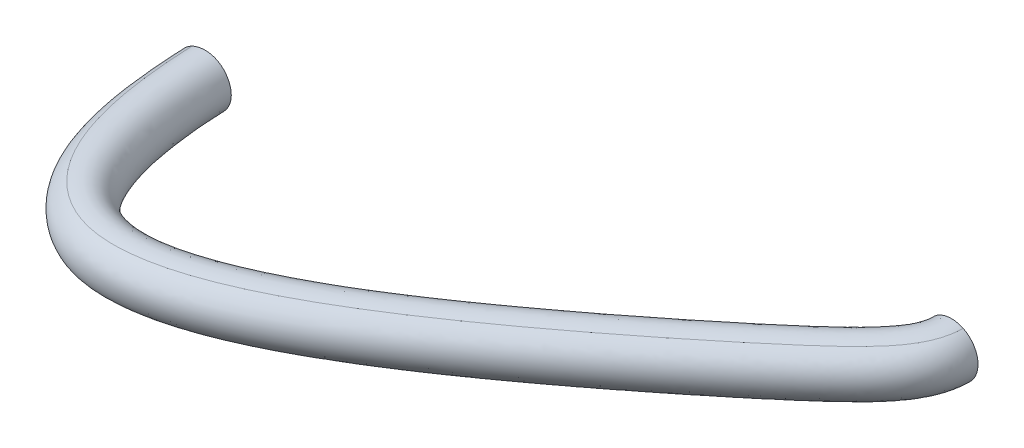
ISO-10303-21;
HEADER;
FILE_DESCRIPTION(('STEP AP214'),'2;1');
FILE_NAME('part.step','',(''),(''),'','','');
FILE_SCHEMA(('AUTOMOTIVE_DESIGN { 1 0 10303 214 1 1 1 1 }'));
ENDSEC;
DATA;
#1=APPLICATION_CONTEXT('core data for automotive mechanical design processes');
#2=APPLICATION_PROTOCOL_DEFINITION('international standard','automotive_design',2000,#1);
#3=PRODUCT_CONTEXT('',#1,'mechanical');
#4=PRODUCT('Part','Part','',(#3));
#5=PRODUCT_RELATED_PRODUCT_CATEGORY('part','',(#4));
#6=PRODUCT_DEFINITION_FORMATION('','',#4);
#7=PRODUCT_DEFINITION_CONTEXT('part definition',#1,'design');
#8=PRODUCT_DEFINITION('design','',#6,#7);
#9=PRODUCT_DEFINITION_SHAPE('','',#8);
#10=(LENGTH_UNIT() NAMED_UNIT(*) SI_UNIT(.MILLI.,.METRE.));
#11=(NAMED_UNIT(*) PLANE_ANGLE_UNIT() SI_UNIT($,.RADIAN.));
#12=(NAMED_UNIT(*) SI_UNIT($,.STERADIAN.) SOLID_ANGLE_UNIT());
#13=UNCERTAINTY_MEASURE_WITH_UNIT(LENGTH_MEASURE(1.E-05),#10,'distance_accuracy_value','');
#14=(GEOMETRIC_REPRESENTATION_CONTEXT(3) GLOBAL_UNCERTAINTY_ASSIGNED_CONTEXT((#13)) GLOBAL_UNIT_ASSIGNED_CONTEXT((#10,
#11,#12)) REPRESENTATION_CONTEXT('',''));
#15=CARTESIAN_POINT('',(0.,0.,0.));
#16=DIRECTION('',(0.,0.,1.));
#17=DIRECTION('',(1.,0.,0.));
#18=AXIS2_PLACEMENT_3D('',#15,#16,#17);
#19=CARTESIAN_POINT('',(0.005,-0.015,0.38));
#20=CARTESIAN_POINT('',(0.006557474261579,-0.015,0.419047749713));
#21=CARTESIAN_POINT('',(0.01842559288904,-0.015,0.470007075915));
#22=CARTESIAN_POINT('',(0.05072787580329,-0.015,0.492409384659));
#23=CARTESIAN_POINT('',(0.09265207975633,-0.015,0.49542710813));
#24=CARTESIAN_POINT('',(0.153025798294,-0.015,0.471761765824));
#25=CARTESIAN_POINT('',(0.233879896269,-0.015,0.414932300408));
#26=CARTESIAN_POINT('',(0.293069376074,-0.015,0.367906845199));
#27=CARTESIAN_POINT('',(0.324563591851,-0.015,0.341018848423));
#28=CARTESIAN_POINT('',(0.34547789,-0.015,0.319341958793));
#29=CARTESIAN_POINT('',(0.350000016624,-0.015,0.308052981527));
#30=CARTESIAN_POINT('',(0.350000016624,-0.015,0.300000014249));
#31=CARTESIAN_POINT('',(0.007242211865819,-0.015,0.379910566235));
#32=CARTESIAN_POINT('',(0.008790809261584,-0.015,0.418735762264));
#33=CARTESIAN_POINT('',(0.02079235202687,-0.015,0.469060161785));
#34=CARTESIAN_POINT('',(0.05155070911989,-0.015,0.490136699165));
#35=CARTESIAN_POINT('',(0.09196723121776,-0.015,0.493200372818));
#36=CARTESIAN_POINT('',(0.15186993797,-0.015,0.469847530246));
#37=CARTESIAN_POINT('',(0.232516978086,-0.015,0.413138733967));
#38=CARTESIAN_POINT('',(0.29165324121,-0.015,0.366165772673));
#39=CARTESIAN_POINT('',(0.323082573523,-0.015,0.339341658557));
#40=CARTESIAN_POINT('',(0.343692170929,-0.015,0.317907755657));
#41=CARTESIAN_POINT('',(0.347756021872,-0.015,0.30744343981));
#42=CARTESIAN_POINT('',(0.347756021872,-0.015,0.300000014249));
#43=CARTESIAN_POINT('',(0.01388476138257,-0.01357926649544,0.379645618831));
#44=CARTESIAN_POINT('',(0.01540827786274,-0.01357926649544,0.417842006193));
#45=CARTESIAN_POINT('',(0.02774554629291,-0.01357926649544,0.466197778229));
#46=CARTESIAN_POINT('',(0.05398379293613,-0.01357926649544,0.483441303791));
#47=CARTESIAN_POINT('',(0.08999963680581,-0.01357926649544,0.486613861152));
#48=CARTESIAN_POINT('',(0.148423724582,-0.01357926649544,0.464170570238));
#49=CARTESIAN_POINT('',(0.228497078217,-0.01357926649544,0.407828571374));
#50=CARTESIAN_POINT('',(0.287453206429,-0.01357926649544,0.361000122334));
#51=CARTESIAN_POINT('',(0.318686615735,-0.01357926649544,0.334398392806));
#52=CARTESIAN_POINT('',(0.338407169199,-0.01357926649544,0.313633321723));
#53=CARTESIAN_POINT('',(0.341108190555,-0.01357926649544,0.305721225611));
#54=CARTESIAN_POINT('',(0.341108190555,-0.01357926649544,0.300000014249));
#55=CARTESIAN_POINT('',(0.02353279027151,-0.001737662492842,0.379260793668));
#56=CARTESIAN_POINT('',(0.02501902939073,-0.001737662492842,0.416522592833));
#57=CARTESIAN_POINT('',(0.03788544009124,-0.001737662492842,0.462080131594));
#58=CARTESIAN_POINT('',(0.05752092514672,-0.001737662492842,0.473690420028));
#59=CARTESIAN_POINT('',(0.08709906967364,-0.001737662492842,0.477040121257));
#60=CARTESIAN_POINT('',(0.143433565964,-0.001737662492842,0.455929231292));
#61=CARTESIAN_POINT('',(0.222645968658,-0.001737662492842,0.400113495749));
#62=CARTESIAN_POINT('',(0.281356132219,-0.001737662492842,0.353502614822));
#63=CARTESIAN_POINT('',(0.312307555228,-0.001737662492842,0.327200789267));
#64=CARTESIAN_POINT('',(0.330727304881,-0.001737662492842,0.307442738112));
#65=CARTESIAN_POINT('',(0.331452490071,-0.001737662492842,0.303161526382));
#66=CARTESIAN_POINT('',(0.331452490071,-0.001737662492842,0.300000014249));
#67=CARTESIAN_POINT('',(0.01517780091992,0.01557342152532,0.379594044136));
#68=CARTESIAN_POINT('',(0.01669623989436,0.01557342152532,0.417663132332));
#69=CARTESIAN_POINT('',(0.02910841530669,0.01557342152532,0.465649757129));
#70=CARTESIAN_POINT('',(0.05445814885886,0.01557342152532,0.482131970717));
#71=CARTESIAN_POINT('',(0.08960679319997,0.01557342152532,0.485330095041));
#72=CARTESIAN_POINT('',(0.147756411067,0.01557342152532,0.463066461651));
#73=CARTESIAN_POINT('',(0.227711716813,0.01557342152532,0.406794368846));
#74=CARTESIAN_POINT('',(0.28663638728,0.01557342152532,0.359995815837));
#75=CARTESIAN_POINT('',(0.317832252845,0.01557342152532,0.333432059154));
#76=CARTESIAN_POINT('',(0.337377557512,0.01557342152532,0.312805369235));
#77=CARTESIAN_POINT('',(0.339814122862,0.01557342152532,0.305372571974));
#78=CARTESIAN_POINT('',(0.339814122862,0.01557342152532,0.300000014249));
#79=CARTESIAN_POINT('',(0.002526593477922,0.01546818446495,0.380098655288));
#80=CARTESIAN_POINT('',(0.004093574195109,0.01546818446495,0.419384743257));
#81=CARTESIAN_POINT('',(0.01582849219146,0.01546818446495,0.471065045818));
#82=CARTESIAN_POINT('',(0.04982127047533,0.01546818446495,0.494907617769));
#83=CARTESIAN_POINT('',(0.09339315710763,0.01546818446495,0.497881050005));
#84=CARTESIAN_POINT('',(0.15430600015,0.01546818446495,0.473874796551));
#85=CARTESIAN_POINT('',(0.23537917888,0.01546818446495,0.416910032546));
#86=CARTESIAN_POINT('',(0.294632641038,0.01546818446495,0.369829253808));
#87=CARTESIAN_POINT('',(0.326199300556,0.01546818446495,0.34286300788));
#88=CARTESIAN_POINT('',(0.347446516439,0.01546818446495,0.320930055828));
#89=CARTESIAN_POINT('',(0.352475389867,0.01546818446495,0.308705754859));
#90=CARTESIAN_POINT('',(0.352475389867,0.01546818446495,0.300000014249));
#91=CARTESIAN_POINT('',(-0.00152858359605,0.0135175903309,0.380260401713));
#92=CARTESIAN_POINT('',(5.395365600005E-05,0.0135175903309,0.419936510688));
#93=CARTESIAN_POINT('',(0.01157192659682,0.0135175903309,0.47280098011));
#94=CARTESIAN_POINT('',(0.04833499127388,0.0135175903309,0.49900259377));
#95=CARTESIAN_POINT('',(0.094606681011,0.0135175903309,0.501904068374));
#96=CARTESIAN_POINT('',(0.156405436219,0.0135175903309,0.477339279514));
#97=CARTESIAN_POINT('',(0.237836840377,0.0135175903309,0.42015246689));
#98=CARTESIAN_POINT('',(0.297195745534,0.0135175903309,0.372981250452));
#99=CARTESIAN_POINT('',(0.328881266912,0.0135175903309,0.345885913553));
#100=CARTESIAN_POINT('',(0.350673975661,0.0135175903309,0.323534377141));
#101=CARTESIAN_POINT('',(0.3565337914,0.0135175903309,0.309773964874));
#102=CARTESIAN_POINT('',(0.3565337914,0.0135175903309,0.300000014249));
#103=(BOUNDED_SURFACE() B_SPLINE_SURFACE(3,3,((#19,#20,#21,#22,#23,#24,#25,#26,#27,#28,#29,#30),
(#31,#32,#33,#34,#35,#36,#37,#38,#39,#40,#41,#42),(#43,#44,#45,#46,#47,#48,#49,#50,#51,#52,#53,
#54),(#55,#56,#57,#58,#59,#60,#61,#62,#63,#64,#65,#66),(#67,#68,#69,#70,#71,#72,#73,#74,#75,#76,
#77,#78),(#79,#80,#81,#82,#83,#84,#85,#86,#87,#88,#89,#90),(#91,#92,#93,#94,#95,#96,#97,#98,#99,
#100,#101,#102)),.UNSPECIFIED.,.F.,.F.,.F.) B_SPLINE_SURFACE_WITH_KNOTS((4,1,1,1,4),(4,1,1,1,1,
1,1,1,1,4),(-3.14159265359,-2.692793703077,-1.795195802051,-0.448798950513,0.448798950513),(0.,
0.142857142857,0.25,0.285714285714,0.428571428571,0.571428571429,0.678571428571,0.785714285714,
0.857142857143,1.),
.UNSPECIFIED.) GEOMETRIC_REPRESENTATION_ITEM() RATIONAL_B_SPLINE_SURFACE(((1.,1.,1.,1.,1.,1.,1.,
1.,1.,1.,1.,1.),(1.,1.,1.,1.,1.,1.,1.,1.,1.,1.,1.,1.),(1.,1.,1.,1.,1.,1.,1.,1.,1.,1.,1.,1.),(1.,
1.,1.,1.,1.,1.,1.,1.,1.,1.,1.,1.),(1.,1.,1.,1.,1.,1.,1.,1.,1.,1.,1.,1.),(1.,1.,1.,1.,1.,1.,1.,
1.,1.,1.,1.,1.),(1.,1.,1.,1.,1.,1.,1.,1.,1.,1.,1.,1.))) REPRESENTATION_ITEM('') SURFACE());
#104=CARTESIAN_POINT('',(0.00500000000011853,-0.015,0.380000000002972));
#105=CARTESIAN_POINT('',(0.00724221186593686,-0.015,0.379910566237955));
#106=CARTESIAN_POINT('',(0.0138847613826859,-0.01357926649544,0.379645618833907));
#107=CARTESIAN_POINT('',(0.0235327902716231,-0.001737662492842,0.379260793670836));
#108=CARTESIAN_POINT('',(0.0151778009200356,0.01557342152532,0.379594044138897));
#109=CARTESIAN_POINT('',(0.00252659347804125,0.01546818446495,0.38009865529099));
#110=CARTESIAN_POINT('',(-0.00152858359592956,0.0135175903309,0.38026040171602));
#111=(BOUNDED_CURVE() B_SPLINE_CURVE(3,(#104,#105,#106,#107,#108,#109,#110),.UNSPECIFIED.,.F.,
.F.) B_SPLINE_CURVE_WITH_KNOTS((4,1,1,1,4),(-3.14159265359,-2.692793703077,-1.795195802051,
-0.448798950513,0.448798950513),
.UNSPECIFIED.) CURVE() GEOMETRIC_REPRESENTATION_ITEM() RATIONAL_B_SPLINE_CURVE((1.,1.,1.,1.,1.,
1.,1.)) REPRESENTATION_ITEM(''));
#112=CARTESIAN_POINT('',(0.005,-0.015,0.38));
#113=VERTEX_POINT('',#112);
#114=CARTESIAN_POINT('',(-0.001535819537403,0.01353381759162,0.380260690329));
#115=VERTEX_POINT('',#114);
#116=EDGE_CURVE('E30',#113,#115,#111,.T.);
#117=CARTESIAN_POINT('',(-0.00152858359605,0.0135175903309,0.380260401713));
#118=CARTESIAN_POINT('',(5.395365600005E-05,0.0135175903309,0.419936510688));
#119=CARTESIAN_POINT('',(0.01157192659682,0.0135175903309,0.47280098011));
#120=CARTESIAN_POINT('',(0.04833499127388,0.0135175903309,0.49900259377));
#121=CARTESIAN_POINT('',(0.094606681011,0.0135175903309,0.501904068374));
#122=CARTESIAN_POINT('',(0.156405436219,0.0135175903309,0.477339279514));
#123=CARTESIAN_POINT('',(0.237836840377,0.0135175903309,0.42015246689));
#124=CARTESIAN_POINT('',(0.297195745534,0.0135175903309,0.372981250452));
#125=CARTESIAN_POINT('',(0.328881266912,0.0135175903309,0.345885913553));
#126=CARTESIAN_POINT('',(0.350673975661,0.0135175903309,0.323534377141));
#127=CARTESIAN_POINT('',(0.3565337914,0.0135175903309,0.309773964874));
#128=CARTESIAN_POINT('',(0.3565337914,0.0135175903309,0.300000014249));
#129=(BOUNDED_CURVE() B_SPLINE_CURVE(3,(#117,#118,#119,#120,#121,#122,#123,#124,#125,#126,#127,
#128),.UNSPECIFIED.,.F.,.F.) B_SPLINE_CURVE_WITH_KNOTS((4,1,1,1,1,1,1,1,1,4),(0.,0.142857142857,
0.25,0.285714285714,0.428571428571,0.571428571429,0.678571428571,0.785714285714,0.857142857143,
1.),.UNSPECIFIED.) CURVE() GEOMETRIC_REPRESENTATION_ITEM() RATIONAL_B_SPLINE_CURVE((1.,1.,1.,1.,
1.,1.,1.,1.,1.,1.,1.,1.)) REPRESENTATION_ITEM(''));
#130=CARTESIAN_POINT('',(0.356533778506,0.01351756661418,0.300000014249));
#131=VERTEX_POINT('',#130);
#132=EDGE_CURVE('E54',#115,#131,#129,.T.);
#133=CARTESIAN_POINT('',(0.3565337914,0.0135175903309,0.300000014249));
#134=CARTESIAN_POINT('',(0.352475389867,0.01546818446495,0.300000014249));
#135=CARTESIAN_POINT('',(0.339814122862,0.01557342152532,0.300000014249));
#136=CARTESIAN_POINT('',(0.331452490071,-0.001737662492842,0.300000014249));
#137=CARTESIAN_POINT('',(0.341108190555,-0.01357926649544,0.300000014249));
#138=CARTESIAN_POINT('',(0.347756021872,-0.015,0.300000014249));
#139=CARTESIAN_POINT('',(0.350000016624,-0.015,0.300000014249));
#140=(BOUNDED_CURVE() B_SPLINE_CURVE(3,(#133,#134,#135,#136,#137,#138,#139),.UNSPECIFIED.,.F.,
.F.) B_SPLINE_CURVE_WITH_KNOTS((4,1,1,1,4),(-3.14159265359,-2.243994752564,-0.897597901026,0.,
0.448798950513),
.UNSPECIFIED.) CURVE() GEOMETRIC_REPRESENTATION_ITEM() RATIONAL_B_SPLINE_CURVE((1.,1.,1.,1.,1.,
1.,1.)) REPRESENTATION_ITEM(''));
#141=CARTESIAN_POINT('',(0.350000016624,-0.015,0.300000014249));
#142=VERTEX_POINT('',#141);
#143=EDGE_CURVE('E11',#142,#131,#140,.F.);
#144=CARTESIAN_POINT('',(0.005,-0.015,0.38));
#145=CARTESIAN_POINT('',(0.005778737130792,-0.015,0.399523874856));
#146=CARTESIAN_POINT('',(0.007515621863847,-0.01499999999999,0.417232028235));
#147=CARTESIAN_POINT('',(0.01019272892047,-0.01500000000001,0.433141976618));
#148=CARTESIAN_POINT('',(0.01382238984853,-0.01499999999998,0.447232875823));
#149=CARTESIAN_POINT('',(0.01842538499625,-0.01500000000003,0.459473144587));
#150=CARTESIAN_POINT('',(0.02401549894582,-0.01499999999997,0.469839973693));
#151=CARTESIAN_POINT('',(0.03059043941091,-0.01500000000002,0.478330720727));
#152=CARTESIAN_POINT('',(0.03812911959229,-0.01499999999999,0.484966190353));
#153=CARTESIAN_POINT('',(0.04659530399853,-0.01500000000001,0.489785800224));
#154=CARTESIAN_POINT('',(0.05594761772462,-0.015,0.492834632429));
#155=CARTESIAN_POINT('',(0.06615591919479,-0.015,0.494142370543));
#156=CARTESIAN_POINT('',(0.0882921535349,-0.015,0.493245873949));
#157=CARTESIAN_POINT('',(0.100223730548,-0.015,0.491035041519));
#158=CARTESIAN_POINT('',(0.112867992916,-0.01499999999999,0.487264006157));
#159=CARTESIAN_POINT('',(0.126110330321,-0.01500000000001,0.482085015298));
#160=CARTESIAN_POINT('',(0.139846156031,-0.01499999999998,0.47563642084));
#161=CARTESIAN_POINT('',(0.153962235063,-0.01500000000001,0.468068563624));
#162=CARTESIAN_POINT('',(0.168325481062,-0.01499999999999,0.459559304083));
#163=CARTESIAN_POINT('',(0.182779221944,-0.01500000000001,0.450319199163));
#164=CARTESIAN_POINT('',(0.197146934257,-0.015,0.440586325404));
#165=CARTESIAN_POINT('',(0.211243446296,-0.015,0.430610748285));
#166=CARTESIAN_POINT('',(0.22489360994,-0.015,0.42062863775));
#167=CARTESIAN_POINT('',(0.257555688191,-0.015,0.396122118324));
#168=CARTESIAN_POINT('',(0.275945550487,-0.015,0.381658387208));
#169=CARTESIAN_POINT('',(0.291450803387,-0.01500000000001,0.369830965455));
#170=CARTESIAN_POINT('',(0.31031414583,-0.01499999999999,0.351392963739));
#171=CARTESIAN_POINT('',(0.312747993757,-0.01500000000002,0.355333418741));
#172=CARTESIAN_POINT('',(0.335727950439,-0.01499999999998,0.327210310964));
#173=CARTESIAN_POINT('',(0.331514973562,-0.01500000000002,0.337380109009));
#174=CARTESIAN_POINT('',(0.344021348933,-0.01499999999999,0.320890502664));
#175=CARTESIAN_POINT('',(0.345632683237,-0.01500000000001,0.31846708728));
#176=CARTESIAN_POINT('',(0.348835167037,-0.015,0.311766143979));
#177=CARTESIAN_POINT('',(0.350000016624,-0.015,0.306039739708));
#178=CARTESIAN_POINT('',(0.350000016624,-0.015,0.300000014249));
#179=(BOUNDED_CURVE() B_SPLINE_CURVE(12,(#144,#145,#146,#147,#148,#149,#150,#151,#152,#153,#154,
#155,#156,#157,#158,#159,#160,#161,#162,#163,#164,#165,#166,#167,#168,#169,#170,#171,#172,#173,
#174,#175,#176,#177,#178),.UNSPECIFIED.,.F.,.F.) B_SPLINE_CURVE_WITH_KNOTS((13,11,11,13),(0.,
0.285714285714,0.571428571429,1.),
.UNSPECIFIED.) CURVE() GEOMETRIC_REPRESENTATION_ITEM() RATIONAL_B_SPLINE_CURVE((1.,1.,1.,1.,1.,
1.,1.,1.,1.,1.,1.,1.,1.,1.,1.,1.,1.,1.,1.,1.,1.,1.,1.,1.,1.,1.,1.,1.,1.,1.,1.,1.,1.,1.,1.)) REPRESENTATION_ITEM(''));
#180=EDGE_CURVE('E56',#113,#142,#179,.T.);
#181=ORIENTED_EDGE('',*,*,#116,.T.);
#182=ORIENTED_EDGE('',*,*,#132,.T.);
#183=ORIENTED_EDGE('',*,*,#143,.F.);
#184=ORIENTED_EDGE('',*,*,#180,.F.);
#185=EDGE_LOOP('',(#181,#182,#183,#184));
#186=FACE_BOUND('',#185,.T.);
#187=ADVANCED_FACE('F17',(#186),#103,.T.);
#188=CARTESIAN_POINT('',(0.350000016624,0.,0.300000014249));
#189=DIRECTION('',(0.,0.,-1.));
#190=DIRECTION('',(-1.,0.,0.));
#191=AXIS2_PLACEMENT_3D('',#188,#189,#190);
#192=PLANE('',#191);
#193=ORIENTED_EDGE('',*,*,#143,.T.);
#194=CARTESIAN_POINT('',(0.350000016624,-0.015,0.300000014249));
#195=CARTESIAN_POINT('',(0.354488006129,-0.015,0.300000014249));
#196=CARTESIAN_POINT('',(0.363441995232,-0.01072977434251,0.300000014249));
#197=CARTESIAN_POINT('',(0.366696785464,0.003848809308946,0.300000014249));
#198=CARTESIAN_POINT('',(0.360592192934,0.01156699619685,0.300000014249));
#199=CARTESIAN_POINT('',(0.3565337914,0.0135175903309,0.300000014249));
#200=(BOUNDED_CURVE() B_SPLINE_CURVE(3,(#194,#195,#196,#197,#198,#199),.UNSPECIFIED.,.F.,
.F.) B_SPLINE_CURVE_WITH_KNOTS((4,1,1,4),(0.448798950513,1.346396851539,2.243994752565,
3.14159265359),
.UNSPECIFIED.) CURVE() GEOMETRIC_REPRESENTATION_ITEM() RATIONAL_B_SPLINE_CURVE((1.,1.,1.,1.,1.,1.)) REPRESENTATION_ITEM(''));
#201=EDGE_CURVE('E61',#131,#142,#200,.F.);
#202=ORIENTED_EDGE('',*,*,#201,.T.);
#203=EDGE_LOOP('',(#193,#202));
#204=FACE_BOUND('',#203,.T.);
#205=ADVANCED_FACE('F107',(#204),#192,.T.);
#206=CARTESIAN_POINT('',(0.005,0.,0.38));
#207=DIRECTION('',(0.0398547121637157,0.,0.999205485332395));
#208=DIRECTION('',(0.,-1.,0.));
#209=AXIS2_PLACEMENT_3D('',#206,#207,#208);
#210=PLANE('',#209);
#211=ORIENTED_EDGE('',*,*,#116,.F.);
#212=CARTESIAN_POINT('',(-0.00152858359605,0.0135175903309,0.380260401713));
#213=CARTESIAN_POINT('',(-0.005583760670022,0.01156699619685,0.380422148138));
#214=CARTESIAN_POINT('',(-0.01168350301231,0.003848809308946,0.380665444916));
#215=CARTESIAN_POINT('',(-0.008431298758439,-0.01072977434251,0.380535726188));
#216=CARTESIAN_POINT('',(0.0005155762683616,-0.015,0.38017886753));
#217=CARTESIAN_POINT('',(0.005,-0.015,0.38));
#218=(BOUNDED_CURVE() B_SPLINE_CURVE(3,(#212,#213,#214,#215,#216,#217),.UNSPECIFIED.,.F.,
.F.) B_SPLINE_CURVE_WITH_KNOTS((4,1,1,4),(0.448798950513,1.346396851538,2.243994752564,
3.14159265359),
.UNSPECIFIED.) CURVE() GEOMETRIC_REPRESENTATION_ITEM() RATIONAL_B_SPLINE_CURVE((1.,1.,1.,1.,1.,1.)) REPRESENTATION_ITEM(''));
#219=EDGE_CURVE('E64',#115,#113,#218,.T.);
#220=ORIENTED_EDGE('',*,*,#219,.F.);
#221=EDGE_LOOP('',(#211,#220));
#222=FACE_BOUND('',#221,.T.);
#223=ADVANCED_FACE('F19',(#222),#210,.F.);
#224=CARTESIAN_POINT('',(-0.00152858359605,0.0135175903309,0.380260401713));
#225=CARTESIAN_POINT('',(5.395365600005E-05,0.0135175903309,0.419936510688));
#226=CARTESIAN_POINT('',(0.01157192659682,0.0135175903309,0.47280098011));
#227=CARTESIAN_POINT('',(0.04833499127388,0.0135175903309,0.49900259377));
#228=CARTESIAN_POINT('',(0.094606681011,0.0135175903309,0.501904068374));
#229=CARTESIAN_POINT('',(0.156405436219,0.0135175903309,0.477339279514));
#230=CARTESIAN_POINT('',(0.237836840377,0.0135175903309,0.42015246689));
#231=CARTESIAN_POINT('',(0.297195745534,0.0135175903309,0.372981250452));
#232=CARTESIAN_POINT('',(0.328881266912,0.0135175903309,0.345885913553));
#233=CARTESIAN_POINT('',(0.350673975661,0.0135175903309,0.323534377141));
#234=CARTESIAN_POINT('',(0.3565337914,0.0135175903309,0.309773964874));
#235=CARTESIAN_POINT('',(0.3565337914,0.0135175903309,0.300000014249));
#236=CARTESIAN_POINT('',(-0.005583760670022,0.01156699619685,0.380422148138));
#237=CARTESIAN_POINT('',(-0.003985666883109,0.01156699619685,0.42048827812));
#238=CARTESIAN_POINT('',(0.007315361002187,0.01156699619685,0.474536914401));
#239=CARTESIAN_POINT('',(0.04684871207243,0.01156699619685,0.503097569771));
#240=CARTESIAN_POINT('',(0.09582020491438,0.01156699619685,0.505927086744));
#241=CARTESIAN_POINT('',(0.158504872287,0.01156699619685,0.480803762477));
#242=CARTESIAN_POINT('',(0.240294501874,0.01156699619685,0.423394901234));
#243=CARTESIAN_POINT('',(0.299758850031,0.01156699619685,0.376133247097));
#244=CARTESIAN_POINT('',(0.331563233267,0.01156699619685,0.348908819227));
#245=CARTESIAN_POINT('',(0.353901434883,0.01156699619685,0.326138698453));
#246=CARTESIAN_POINT('',(0.360592192934,0.01156699619685,0.310842174889));
#247=CARTESIAN_POINT('',(0.360592192934,0.01156699619685,0.300000014249));
#248=CARTESIAN_POINT('',(-0.01168350301231,0.003848809308946,0.380665444916));
#249=CARTESIAN_POINT('',(-0.01006201648014,0.003848809308946,0.421318059108));
#250=CARTESIAN_POINT('',(0.0009130371158356,0.003848809308946,0.477148420615));
#251=CARTESIAN_POINT('',(0.04461309797344,0.003848809308946,0.509256956134));
#252=CARTESIAN_POINT('',(0.09764520940174,0.003848809308946,0.511978396249));
#253=CARTESIAN_POINT('',(0.161662945295,0.003848809308946,0.486015026406));
#254=CARTESIAN_POINT('',(0.243991178206,0.003848809308946,0.428272107651));
#255=CARTESIAN_POINT('',(0.30361426501,0.003848809308946,0.380874483297));
#256=CARTESIAN_POINT('',(0.335597460521,0.003848809308946,0.35345568294));
#257=CARTESIAN_POINT('',(0.35875610463,0.003848809308946,0.330056234428));
#258=CARTESIAN_POINT('',(0.366696785464,0.003848809308946,0.312448468642));
#259=CARTESIAN_POINT('',(0.366696785464,0.003848809308946,0.300000014249));
#260=CARTESIAN_POINT('',(-0.008431298758439,-0.01072977434251,0.380535726188));
#261=CARTESIAN_POINT('',(-0.006822161962956,-0.01072977434251,0.420878717654));
#262=CARTESIAN_POINT('',(0.004320692630425,-0.01072977434251,0.475750283835));
#263=CARTESIAN_POINT('',(0.04580460274772,-0.01072977434251,0.505976722721));
#264=CARTESIAN_POINT('',(0.09667834315652,-0.01072977434251,0.508753041465));
#265=CARTESIAN_POINT('',(0.159976938753,-0.01072977434251,0.483235924355));
#266=CARTESIAN_POINT('',(0.242022006119,-0.01072977434251,0.425672053808));
#267=CARTESIAN_POINT('',(0.301558193205,-0.01072977434251,0.378345816459));
#268=CARTESIAN_POINT('',(0.333445677877,-0.01072977434251,0.351033987902));
#269=CARTESIAN_POINT('',(0.356168259419,-0.01072977434251,0.327964938682));
#270=CARTESIAN_POINT('',(0.363441995232,-0.01072977434251,0.311600457659));
#271=CARTESIAN_POINT('',(0.363441995232,-0.01072977434251,0.300000014249));
#272=CARTESIAN_POINT('',(0.0005155762683616,-0.015,0.38017886753));
#273=CARTESIAN_POINT('',(0.002090102427354,-0.015,0.419654128784));
#274=CARTESIAN_POINT('',(0.01372571685595,-0.015,0.471933868916));
#275=CARTESIAN_POINT('',(0.0490848386157,-0.015,0.496933165002));
#276=CARTESIAN_POINT('',(0.0939864376336,-0.015,0.499874702051));
#277=CARTESIAN_POINT('',(0.155350196158,-0.015,0.475593720686));
#278=CARTESIAN_POINT('',(0.236595498399,-0.015,0.418517544015));
#279=CARTESIAN_POINT('',(0.295904378202,-0.015,0.371393446217));
#280=CARTESIAN_POINT('',(0.327530498406,-0.015,0.344358573643));
#281=CARTESIAN_POINT('',(0.34904633544,-0.015,0.322225136244));
#282=CARTESIAN_POINT('',(0.354488006129,-0.015,0.309223872587));
#283=CARTESIAN_POINT('',(0.354488006129,-0.015,0.300000014249));
#284=CARTESIAN_POINT('',(0.005,-0.015,0.38));
#285=CARTESIAN_POINT('',(0.006557474261579,-0.015,0.419047749713));
#286=CARTESIAN_POINT('',(0.01842559288904,-0.015,0.470007075915));
#287=CARTESIAN_POINT('',(0.05072787580329,-0.015,0.492409384659));
#288=CARTESIAN_POINT('',(0.09265207975633,-0.015,0.49542710813));
#289=CARTESIAN_POINT('',(0.153025798294,-0.015,0.471761765824));
#290=CARTESIAN_POINT('',(0.233879896269,-0.015,0.414932300408));
#291=CARTESIAN_POINT('',(0.293069376074,-0.015,0.367906845199));
#292=CARTESIAN_POINT('',(0.324563591851,-0.015,0.341018848423));
#293=CARTESIAN_POINT('',(0.34547789,-0.015,0.319341958793));
#294=CARTESIAN_POINT('',(0.350000016624,-0.015,0.308052981527));
#295=CARTESIAN_POINT('',(0.350000016624,-0.015,0.300000014249));
#296=(BOUNDED_SURFACE() B_SPLINE_SURFACE(3,3,((#224,#225,#226,#227,#228,#229,#230,#231,#232,
#233,#234,#235),(#236,#237,#238,#239,#240,#241,#242,#243,#244,#245,#246,#247),(#248,#249,#250,
#251,#252,#253,#254,#255,#256,#257,#258,#259),(#260,#261,#262,#263,#264,#265,#266,#267,#268,
#269,#270,#271),(#272,#273,#274,#275,#276,#277,#278,#279,#280,#281,#282,#283),(#284,#285,#286,
#287,#288,#289,#290,#291,#292,#293,#294,#295)),.UNSPECIFIED.,.F.,.F.,
.F.) B_SPLINE_SURFACE_WITH_KNOTS((4,1,1,4),(4,1,1,1,1,1,1,1,1,4),(0.448798950513,1.346396851538,
2.243994752564,3.14159265359),(0.,0.142857142857,0.25,0.285714285714,0.428571428571,
0.571428571429,0.678571428571,0.785714285714,0.857142857143,1.),
.UNSPECIFIED.) GEOMETRIC_REPRESENTATION_ITEM() RATIONAL_B_SPLINE_SURFACE(((1.,1.,1.,1.,1.,1.,1.,
1.,1.,1.,1.,1.),(1.,1.,1.,1.,1.,1.,1.,1.,1.,1.,1.,1.),(1.,1.,1.,1.,1.,1.,1.,1.,1.,1.,1.,1.),(1.,
1.,1.,1.,1.,1.,1.,1.,1.,1.,1.,1.),(1.,1.,1.,1.,1.,1.,1.,1.,1.,1.,1.,1.),(1.,1.,1.,1.,1.,1.,1.,
1.,1.,1.,1.,1.))) REPRESENTATION_ITEM('') SURFACE());
#297=ORIENTED_EDGE('',*,*,#132,.F.);
#298=ORIENTED_EDGE('',*,*,#219,.T.);
#299=ORIENTED_EDGE('',*,*,#180,.T.);
#300=ORIENTED_EDGE('',*,*,#201,.F.);
#301=EDGE_LOOP('',(#297,#298,#299,#300));
#302=FACE_BOUND('',#301,.T.);
#303=ADVANCED_FACE('F70',(#302),#296,.T.);
#304=CLOSED_SHELL('',(#187,#205,#223,#303));
#305=MANIFOLD_SOLID_BREP('B1',#304);
#306=ADVANCED_BREP_SHAPE_REPRESENTATION('',(#18,#305),#14);
#307=SHAPE_DEFINITION_REPRESENTATION(#9,#306);
ENDSEC;
END-ISO-10303-21;
